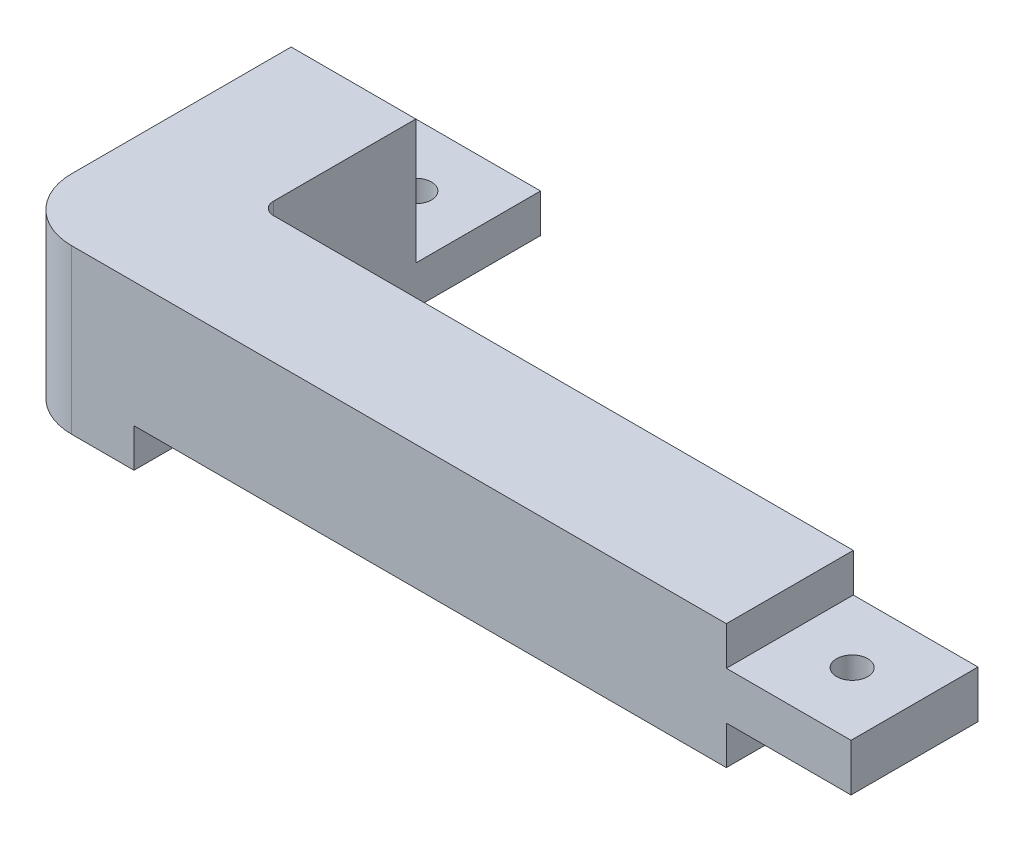
ISO-10303-21;
HEADER;
FILE_DESCRIPTION(('STEP AP214'),'2;1');
FILE_NAME('part.step','',(''),(''),'','','');
FILE_SCHEMA(('AUTOMOTIVE_DESIGN { 1 0 10303 214 1 1 1 1 }'));
ENDSEC;
DATA;
#1=APPLICATION_CONTEXT('core data for automotive mechanical design processes');
#2=APPLICATION_PROTOCOL_DEFINITION('international standard','automotive_design',2000,#1);
#3=PRODUCT_CONTEXT('',#1,'mechanical');
#4=PRODUCT('Part','Part','',(#3));
#5=PRODUCT_RELATED_PRODUCT_CATEGORY('part','',(#4));
#6=PRODUCT_DEFINITION_FORMATION('','',#4);
#7=PRODUCT_DEFINITION_CONTEXT('part definition',#1,'design');
#8=PRODUCT_DEFINITION('design','',#6,#7);
#9=PRODUCT_DEFINITION_SHAPE('','',#8);
#10=(LENGTH_UNIT() NAMED_UNIT(*) SI_UNIT(.MILLI.,.METRE.));
#11=(NAMED_UNIT(*) PLANE_ANGLE_UNIT() SI_UNIT($,.RADIAN.));
#12=(NAMED_UNIT(*) SI_UNIT($,.STERADIAN.) SOLID_ANGLE_UNIT());
#13=UNCERTAINTY_MEASURE_WITH_UNIT(LENGTH_MEASURE(1.E-05),#10,'distance_accuracy_value','');
#14=(GEOMETRIC_REPRESENTATION_CONTEXT(3) GLOBAL_UNCERTAINTY_ASSIGNED_CONTEXT((#13)) GLOBAL_UNIT_ASSIGNED_CONTEXT((#10,
#11,#12)) REPRESENTATION_CONTEXT('',''));
#15=CARTESIAN_POINT('',(0.,0.,0.));
#16=DIRECTION('',(0.,0.,1.));
#17=DIRECTION('',(1.,0.,0.));
#18=AXIS2_PLACEMENT_3D('',#15,#16,#17);
#19=CARTESIAN_POINT('',(147.000196891192,0.,0.));
#20=DIRECTION('',(-1.,0.,0.));
#21=DIRECTION('',(0.,0.,1.));
#22=AXIS2_PLACEMENT_3D('',#19,#20,#21);
#23=PLANE('',#22);
#24=DIRECTION('',(0.,0.,1.));
#25=VECTOR('',#24,1.);
#26=CARTESIAN_POINT('',(147.000196891192,25.4,56.9443652849741));
#27=LINE('',#26,#25);
#28=CARTESIAN_POINT('',(147.000196891192,25.4,31.0847305699482));
#29=VERTEX_POINT('',#28);
#30=CARTESIAN_POINT('',(147.000196891192,25.4,56.9443652849741));
#31=VERTEX_POINT('',#30);
#32=EDGE_CURVE('E173',#29,#31,#27,.T.);
#33=ORIENTED_EDGE('',*,*,#32,.F.);
#34=DIRECTION('',(0.,1.,0.));
#35=VECTOR('',#34,1.);
#36=CARTESIAN_POINT('',(147.000196891192,33.274,31.0847305699482));
#37=LINE('',#36,#35);
#38=CARTESIAN_POINT('',(147.000196891192,33.274,31.0847305699482));
#39=VERTEX_POINT('',#38);
#40=EDGE_CURVE('E216',#29,#39,#37,.T.);
#41=ORIENTED_EDGE('',*,*,#40,.T.);
#42=DIRECTION('',(0.,0.,1.));
#43=VECTOR('',#42,1.);
#44=CARTESIAN_POINT('',(147.000196891192,33.274,31.0847305699482));
#45=LINE('',#44,#43);
#46=CARTESIAN_POINT('',(147.000196891192,33.274,56.9443652849741));
#47=VERTEX_POINT('',#46);
#48=EDGE_CURVE('E215',#39,#47,#45,.T.);
#49=ORIENTED_EDGE('',*,*,#48,.T.);
#50=DIRECTION('',(0.,-1.,0.));
#51=VECTOR('',#50,1.);
#52=CARTESIAN_POINT('',(147.000196891192,33.274,56.9443652849741));
#53=LINE('',#52,#51);
#54=EDGE_CURVE('E220',#47,#31,#53,.T.);
#55=ORIENTED_EDGE('',*,*,#54,.T.);
#56=EDGE_LOOP('',(#33,#41,#49,#55));
#57=FACE_BOUND('',#56,.T.);
#58=ADVANCED_FACE('F45',(#57),#23,.F.);
#59=DIRECTION('',(0.,0.,-1.));
#60=VECTOR('',#59,1.);
#61=CARTESIAN_POINT('',(147.000196891192,15.748,56.9443652849741));
#62=LINE('',#61,#60);
#63=CARTESIAN_POINT('',(147.000196891192,15.748,56.9443652849741));
#64=VERTEX_POINT('',#63);
#65=CARTESIAN_POINT('',(147.000196891192,15.748,31.0847305699482));
#66=VERTEX_POINT('',#65);
#67=EDGE_CURVE('E341',#64,#66,#62,.T.);
#68=ORIENTED_EDGE('',*,*,#67,.F.);
#69=CARTESIAN_POINT('',(147.000196891192,7.874,56.9443652849741));
#70=VERTEX_POINT('',#69);
#71=EDGE_CURVE('E179',#64,#70,#53,.T.);
#72=ORIENTED_EDGE('',*,*,#71,.T.);
#73=DIRECTION('',(0.,0.,-1.));
#74=VECTOR('',#73,1.);
#75=CARTESIAN_POINT('',(147.000196891192,7.874,31.0847305699482));
#76=LINE('',#75,#74);
#77=CARTESIAN_POINT('',(147.000196891192,7.874,31.0847305699482));
#78=VERTEX_POINT('',#77);
#79=EDGE_CURVE('E223',#70,#78,#76,.T.);
#80=ORIENTED_EDGE('',*,*,#79,.T.);
#81=EDGE_CURVE('E212',#78,#66,#37,.T.);
#82=ORIENTED_EDGE('',*,*,#81,.T.);
#83=EDGE_LOOP('',(#68,#72,#80,#82));
#84=FACE_BOUND('',#83,.T.);
#85=ADVANCED_FACE('F340',(#84),#23,.F.);
#86=CARTESIAN_POINT('',(0.,33.274,0.));
#87=DIRECTION('',(0.,1.,0.));
#88=DIRECTION('',(0.,0.,1.));
#89=AXIS2_PLACEMENT_3D('',#86,#87,#88);
#90=PLANE('',#89);
#91=DIRECTION('',(0.,0.,1.));
#92=VECTOR('',#91,1.);
#93=CARTESIAN_POINT('',(0.950196891191725,33.274,56.9443652849741));
#94=LINE('',#93,#92);
#95=CARTESIAN_POINT('',(0.950196891191725,33.274,-0.459634715025914));
#96=VERTEX_POINT('',#95);
#97=CARTESIAN_POINT('',(0.950196891191725,33.274,44.2443652849741));
#98=VERTEX_POINT('',#97);
#99=EDGE_CURVE('E242',#96,#98,#94,.T.);
#100=ORIENTED_EDGE('',*,*,#99,.T.);
#101=CARTESIAN_POINT('',(13.6501968911917,33.274,44.2443652849741));
#102=DIRECTION('',(0.,1.,0.));
#103=DIRECTION('',(0.,0.,1.));
#104=AXIS2_PLACEMENT_3D('',#101,#102,#103);
#105=CIRCLE('',#104,12.7);
#106=CARTESIAN_POINT('',(13.6501968911917,33.274,56.9443652849741));
#107=VERTEX_POINT('',#106);
#108=EDGE_CURVE('E283',#98,#107,#105,.T.);
#109=ORIENTED_EDGE('',*,*,#108,.T.);
#110=DIRECTION('',(1.,0.,0.));
#111=VECTOR('',#110,1.);
#112=CARTESIAN_POINT('',(26.3501968911917,33.274,56.9443652849741));
#113=LINE('',#112,#111);
#114=EDGE_CURVE('E247',#107,#47,#113,.T.);
#115=ORIENTED_EDGE('',*,*,#114,.T.);
#116=ORIENTED_EDGE('',*,*,#48,.F.);
#117=DIRECTION('',(-1.,0.,0.));
#118=VECTOR('',#117,1.);
#119=CARTESIAN_POINT('',(147.000196891192,33.274,31.0847305699482));
#120=LINE('',#119,#118);
#121=CARTESIAN_POINT('',(28.8901968911918,33.274,31.0847305699482));
#122=VERTEX_POINT('',#121);
#123=EDGE_CURVE('E235',#39,#122,#120,.T.);
#124=ORIENTED_EDGE('',*,*,#123,.T.);
#125=CARTESIAN_POINT('',(28.8901968911917,33.274,28.5447305699482));
#126=DIRECTION('',(0.,1.,0.));
#127=DIRECTION('',(0.,0.,1.));
#128=AXIS2_PLACEMENT_3D('',#125,#126,#127);
#129=CIRCLE('',#128,2.54);
#130=CARTESIAN_POINT('',(26.3501968911917,33.274,28.5447305699482));
#131=VERTEX_POINT('',#130);
#132=EDGE_CURVE('E54',#122,#131,#129,.F.);
#133=ORIENTED_EDGE('',*,*,#132,.T.);
#134=DIRECTION('',(0.,0.,-1.));
#135=VECTOR('',#134,1.);
#136=CARTESIAN_POINT('',(26.3501968911917,33.274,56.9443652849741));
#137=LINE('',#136,#135);
#138=CARTESIAN_POINT('',(26.3501968911917,33.274,-0.459634715025914));
#139=VERTEX_POINT('',#138);
#140=EDGE_CURVE('E239',#131,#139,#137,.T.);
#141=ORIENTED_EDGE('',*,*,#140,.T.);
#142=DIRECTION('',(1.,0.,0.));
#143=VECTOR('',#142,1.);
#144=CARTESIAN_POINT('',(26.3501968911917,33.274,-0.459634715025914));
#145=LINE('',#144,#143);
#146=EDGE_CURVE('E201',#96,#139,#145,.T.);
#147=ORIENTED_EDGE('',*,*,#146,.F.);
#148=EDGE_LOOP('',(#100,#109,#115,#116,#124,#133,#141,#147));
#149=FACE_BOUND('',#148,.T.);
#150=ADVANCED_FACE('F304',(#149),#90,.T.);
#151=CARTESIAN_POINT('',(26.3501968911917,33.274,56.9443652849741));
#152=DIRECTION('',(-1.,0.,0.));
#153=DIRECTION('',(0.,0.,1.));
#154=AXIS2_PLACEMENT_3D('',#151,#152,#153);
#155=PLANE('',#154);
#156=ORIENTED_EDGE('',*,*,#140,.F.);
#157=DIRECTION('',(0.,1.,0.));
#158=VECTOR('',#157,1.);
#159=CARTESIAN_POINT('',(26.3501968911917,7.874,28.5447305699482));
#160=LINE('',#159,#158);
#161=CARTESIAN_POINT('',(26.3501968911917,7.874,28.5447305699482));
#162=VERTEX_POINT('',#161);
#163=EDGE_CURVE('E290',#131,#162,#160,.F.);
#164=ORIENTED_EDGE('',*,*,#163,.T.);
#165=DIRECTION('',(0.,0.,-1.));
#166=VECTOR('',#165,1.);
#167=CARTESIAN_POINT('',(26.3501968911917,7.874,31.0847305699482));
#168=LINE('',#167,#166);
#169=CARTESIAN_POINT('',(26.3501968911917,7.874,56.9443652849741));
#170=VERTEX_POINT('',#169);
#171=EDGE_CURVE('E60',#170,#162,#168,.T.);
#172=ORIENTED_EDGE('',*,*,#171,.F.);
#173=DIRECTION('',(0.,-1.,0.));
#174=VECTOR('',#173,1.);
#175=CARTESIAN_POINT('',(26.3501968911917,33.274,56.9443652849741));
#176=LINE('',#175,#174);
#177=CARTESIAN_POINT('',(26.3501968911917,0.,56.9443652849741));
#178=VERTEX_POINT('',#177);
#179=EDGE_CURVE('E250',#170,#178,#176,.T.);
#180=ORIENTED_EDGE('',*,*,#179,.T.);
#181=DIRECTION('',(0.,0.,-1.));
#182=VECTOR('',#181,1.);
#183=CARTESIAN_POINT('',(26.3501968911917,0.,56.9443652849741));
#184=LINE('',#183,#182);
#185=CARTESIAN_POINT('',(26.3501968911917,0.,-25.8596347150259));
#186=VERTEX_POINT('',#185);
#187=EDGE_CURVE('E238',#178,#186,#184,.T.);
#188=ORIENTED_EDGE('',*,*,#187,.T.);
#189=DIRECTION('',(0.,-1.,0.));
#190=VECTOR('',#189,1.);
#191=CARTESIAN_POINT('',(26.3501968911917,33.274,-25.8596347150259));
#192=LINE('',#191,#190);
#193=CARTESIAN_POINT('',(26.3501968911917,7.874,-25.8596347150259));
#194=VERTEX_POINT('',#193);
#195=EDGE_CURVE('E270',#194,#186,#192,.T.);
#196=ORIENTED_EDGE('',*,*,#195,.F.);
#197=DIRECTION('',(0.,0.,-1.));
#198=VECTOR('',#197,1.);
#199=CARTESIAN_POINT('',(26.3501968911917,7.874,-0.459634715025914));
#200=LINE('',#199,#198);
#201=CARTESIAN_POINT('',(26.3501968911917,7.874,-0.459634715025914));
#202=VERTEX_POINT('',#201);
#203=EDGE_CURVE('E204',#202,#194,#200,.T.);
#204=ORIENTED_EDGE('',*,*,#203,.F.);
#205=DIRECTION('',(0.,-1.,0.));
#206=VECTOR('',#205,1.);
#207=CARTESIAN_POINT('',(26.3501968911917,33.274,-0.459634715025914));
#208=LINE('',#207,#206);
#209=EDGE_CURVE('E185',#139,#202,#208,.T.);
#210=ORIENTED_EDGE('',*,*,#209,.F.);
#211=EDGE_LOOP('',(#156,#164,#172,#180,#188,#196,#204,#210));
#212=FACE_BOUND('',#211,.T.);
#213=ADVANCED_FACE('F313',(#212),#155,.F.);
#214=CARTESIAN_POINT('',(26.3501968911917,33.274,-25.8596347150259));
#215=DIRECTION('',(0.,0.,1.));
#216=DIRECTION('',(1.,0.,0.));
#217=AXIS2_PLACEMENT_3D('',#214,#215,#216);
#218=PLANE('',#217);
#219=DIRECTION('',(0.,-1.,0.));
#220=VECTOR('',#219,1.);
#221=CARTESIAN_POINT('',(0.950196891191725,33.274,-25.8596347150259));
#222=LINE('',#221,#220);
#223=CARTESIAN_POINT('',(0.950196891191725,7.874,-25.8596347150259));
#224=VERTEX_POINT('',#223);
#225=CARTESIAN_POINT('',(0.950196891191725,0.,-25.8596347150259));
#226=VERTEX_POINT('',#225);
#227=EDGE_CURVE('E267',#224,#226,#222,.T.);
#228=ORIENTED_EDGE('',*,*,#227,.F.);
#229=DIRECTION('',(-1.,0.,0.));
#230=VECTOR('',#229,1.);
#231=CARTESIAN_POINT('',(26.3501968911917,7.874,-25.8596347150259));
#232=LINE('',#231,#230);
#233=EDGE_CURVE('E181',#194,#224,#232,.T.);
#234=ORIENTED_EDGE('',*,*,#233,.F.);
#235=ORIENTED_EDGE('',*,*,#195,.T.);
#236=DIRECTION('',(-1.,0.,0.));
#237=VECTOR('',#236,1.);
#238=CARTESIAN_POINT('',(26.3501968911917,0.,-25.8596347150259));
#239=LINE('',#238,#237);
#240=EDGE_CURVE('E254',#186,#226,#239,.T.);
#241=ORIENTED_EDGE('',*,*,#240,.T.);
#242=EDGE_LOOP('',(#228,#234,#235,#241));
#243=FACE_BOUND('',#242,.T.);
#244=ADVANCED_FACE('F383',(#243),#218,.F.);
#245=CARTESIAN_POINT('',(0.950196891191725,33.274,56.9443652849741));
#246=DIRECTION('',(1.,0.,0.));
#247=DIRECTION('',(0.,0.,-1.));
#248=AXIS2_PLACEMENT_3D('',#245,#246,#247);
#249=PLANE('',#248);
#250=DIRECTION('',(0.,0.,1.));
#251=VECTOR('',#250,1.);
#252=CARTESIAN_POINT('',(0.950196891191725,0.,56.9443652849741));
#253=LINE('',#252,#251);
#254=CARTESIAN_POINT('',(0.950196891191725,0.,44.2443652849741));
#255=VERTEX_POINT('',#254);
#256=EDGE_CURVE('E258',#226,#255,#253,.T.);
#257=ORIENTED_EDGE('',*,*,#256,.T.);
#258=DIRECTION('',(0.,-1.,0.));
#259=VECTOR('',#258,1.);
#260=CARTESIAN_POINT('',(0.950196891191725,33.274,44.2443652849741));
#261=LINE('',#260,#259);
#262=EDGE_CURVE('E280',#255,#98,#261,.F.);
#263=ORIENTED_EDGE('',*,*,#262,.T.);
#264=ORIENTED_EDGE('',*,*,#99,.F.);
#265=DIRECTION('',(0.,1.,0.));
#266=VECTOR('',#265,1.);
#267=CARTESIAN_POINT('',(0.950196891191732,33.274,-0.459634715025907));
#268=LINE('',#267,#266);
#269=CARTESIAN_POINT('',(0.950196891191732,7.874,-0.459634715025907));
#270=VERTEX_POINT('',#269);
#271=EDGE_CURVE('E198',#270,#96,#268,.T.);
#272=ORIENTED_EDGE('',*,*,#271,.F.);
#273=DIRECTION('',(0.,0.,-1.));
#274=VECTOR('',#273,1.);
#275=CARTESIAN_POINT('',(0.950196891191732,7.874,-0.459634715025907));
#276=LINE('',#275,#274);
#277=EDGE_CURVE('E206',#270,#224,#276,.T.);
#278=ORIENTED_EDGE('',*,*,#277,.T.);
#279=ORIENTED_EDGE('',*,*,#227,.T.);
#280=EDGE_LOOP('',(#257,#263,#264,#272,#278,#279));
#281=FACE_BOUND('',#280,.T.);
#282=ADVANCED_FACE('F323',(#281),#249,.F.);
#283=CARTESIAN_POINT('',(26.3501968911917,33.274,56.9443652849741));
#284=DIRECTION('',(0.,0.,-1.));
#285=DIRECTION('',(-1.,0.,0.));
#286=AXIS2_PLACEMENT_3D('',#283,#284,#285);
#287=PLANE('',#286);
#288=ORIENTED_EDGE('',*,*,#114,.F.);
#289=DIRECTION('',(0.,-1.,0.));
#290=VECTOR('',#289,1.);
#291=CARTESIAN_POINT('',(13.6501968911917,33.274,56.9443652849741));
#292=LINE('',#291,#290);
#293=CARTESIAN_POINT('',(13.6501968911917,0.,56.9443652849741));
#294=VERTEX_POINT('',#293);
#295=EDGE_CURVE('E273',#107,#294,#292,.T.);
#296=ORIENTED_EDGE('',*,*,#295,.T.);
#297=DIRECTION('',(1.,0.,0.));
#298=VECTOR('',#297,1.);
#299=CARTESIAN_POINT('',(26.3501968911917,0.,56.9443652849741));
#300=LINE('',#299,#298);
#301=EDGE_CURVE('E243',#294,#178,#300,.T.);
#302=ORIENTED_EDGE('',*,*,#301,.T.);
#303=ORIENTED_EDGE('',*,*,#179,.F.);
#304=DIRECTION('',(-1.,0.,0.));
#305=VECTOR('',#304,1.);
#306=CARTESIAN_POINT('',(147.000196891192,7.874,56.9443652849741));
#307=LINE('',#306,#305);
#308=EDGE_CURVE('E232',#70,#170,#307,.T.);
#309=ORIENTED_EDGE('',*,*,#308,.F.);
#310=ORIENTED_EDGE('',*,*,#71,.F.);
#311=DIRECTION('',(-1.,0.,0.));
#312=VECTOR('',#311,1.);
#313=CARTESIAN_POINT('',(172.400196891192,15.748,56.9443652849741));
#314=LINE('',#313,#312);
#315=CARTESIAN_POINT('',(172.400196891192,15.748,56.9443652849741));
#316=VERTEX_POINT('',#315);
#317=EDGE_CURVE('E156',#316,#64,#314,.T.);
#318=ORIENTED_EDGE('',*,*,#317,.F.);
#319=DIRECTION('',(0.,-1.,0.));
#320=VECTOR('',#319,1.);
#321=CARTESIAN_POINT('',(172.400196891192,25.4,56.9443652849741));
#322=LINE('',#321,#320);
#323=CARTESIAN_POINT('',(172.400196891192,25.4,56.9443652849741));
#324=VERTEX_POINT('',#323);
#325=EDGE_CURVE('E163',#324,#316,#322,.T.);
#326=ORIENTED_EDGE('',*,*,#325,.F.);
#327=DIRECTION('',(-1.,0.,0.));
#328=VECTOR('',#327,1.);
#329=CARTESIAN_POINT('',(172.400196891192,25.4,56.9443652849741));
#330=LINE('',#329,#328);
#331=EDGE_CURVE('E354',#324,#31,#330,.T.);
#332=ORIENTED_EDGE('',*,*,#331,.T.);
#333=ORIENTED_EDGE('',*,*,#54,.F.);
#334=EDGE_LOOP('',(#288,#296,#302,#303,#309,#310,#318,#326,#332,#333));
#335=FACE_BOUND('',#334,.T.);
#336=ADVANCED_FACE('F177',(#335),#287,.F.);
#337=CARTESIAN_POINT('',(0.,0.,0.));
#338=DIRECTION('',(0.,1.,0.));
#339=DIRECTION('',(0.,0.,1.));
#340=AXIS2_PLACEMENT_3D('',#337,#338,#339);
#341=PLANE('',#340);
#342=CARTESIAN_POINT('',(13.6501968911917,0.,-13.1596347150259));
#343=DIRECTION('',(0.,1.,0.));
#344=DIRECTION('',(0.,0.,1.));
#345=AXIS2_PLACEMENT_3D('',#342,#343,#344);
#346=CIRCLE('',#345,3.175);
#347=CARTESIAN_POINT('',(13.6501968911917,0.,-9.98463471502591));
#348=VERTEX_POINT('',#347);
#349=EDGE_CURVE('E365',#348,#348,#346,.T.);
#350=ORIENTED_EDGE('',*,*,#349,.T.);
#351=EDGE_LOOP('',(#350));
#352=FACE_BOUND('',#351,.T.);
#353=ORIENTED_EDGE('',*,*,#301,.F.);
#354=CARTESIAN_POINT('',(13.6501968911917,0.,44.2443652849741));
#355=DIRECTION('',(0.,1.,0.));
#356=DIRECTION('',(0.,0.,1.));
#357=AXIS2_PLACEMENT_3D('',#354,#355,#356);
#358=CIRCLE('',#357,12.7);
#359=EDGE_CURVE('E277',#294,#255,#358,.F.);
#360=ORIENTED_EDGE('',*,*,#359,.T.);
#361=ORIENTED_EDGE('',*,*,#256,.F.);
#362=ORIENTED_EDGE('',*,*,#240,.F.);
#363=ORIENTED_EDGE('',*,*,#187,.F.);
#364=EDGE_LOOP('',(#353,#360,#361,#362,#363));
#365=FACE_BOUND('',#364,.T.);
#366=ADVANCED_FACE('F333',(#352,#365),#341,.F.);
#367=CARTESIAN_POINT('',(147.000196891192,33.274,31.0847305699482));
#368=DIRECTION('',(0.,0.,1.));
#369=DIRECTION('',(1.,0.,0.));
#370=AXIS2_PLACEMENT_3D('',#367,#368,#369);
#371=PLANE('',#370);
#372=DIRECTION('',(-1.,0.,0.));
#373=VECTOR('',#372,1.);
#374=CARTESIAN_POINT('',(147.000196891192,7.874,31.0847305699482));
#375=LINE('',#374,#373);
#376=CARTESIAN_POINT('',(28.8901968911918,7.874,31.0847305699482));
#377=VERTEX_POINT('',#376);
#378=EDGE_CURVE('E226',#78,#377,#375,.T.);
#379=ORIENTED_EDGE('',*,*,#378,.T.);
#380=DIRECTION('',(0.,1.,0.));
#381=VECTOR('',#380,1.);
#382=CARTESIAN_POINT('',(28.8901968911917,33.274,31.0847305699482));
#383=LINE('',#382,#381);
#384=EDGE_CURVE('E286',#377,#122,#383,.T.);
#385=ORIENTED_EDGE('',*,*,#384,.T.);
#386=ORIENTED_EDGE('',*,*,#123,.F.);
#387=ORIENTED_EDGE('',*,*,#40,.F.);
#388=DIRECTION('',(-1.,0.,0.));
#389=VECTOR('',#388,1.);
#390=CARTESIAN_POINT('',(172.400196891192,25.4,31.0847305699482));
#391=LINE('',#390,#389);
#392=CARTESIAN_POINT('',(172.400196891192,25.4,31.0847305699482));
#393=VERTEX_POINT('',#392);
#394=EDGE_CURVE('E187',#393,#29,#391,.T.);
#395=ORIENTED_EDGE('',*,*,#394,.F.);
#396=DIRECTION('',(0.,1.,0.));
#397=VECTOR('',#396,1.);
#398=CARTESIAN_POINT('',(172.400196891192,25.4,31.0847305699482));
#399=LINE('',#398,#397);
#400=CARTESIAN_POINT('',(172.400196891192,15.748,31.0847305699482));
#401=VERTEX_POINT('',#400);
#402=EDGE_CURVE('E162',#401,#393,#399,.T.);
#403=ORIENTED_EDGE('',*,*,#402,.F.);
#404=DIRECTION('',(-1.,0.,0.));
#405=VECTOR('',#404,1.);
#406=CARTESIAN_POINT('',(172.400196891192,15.748,31.0847305699482));
#407=LINE('',#406,#405);
#408=EDGE_CURVE('E158',#401,#66,#407,.T.);
#409=ORIENTED_EDGE('',*,*,#408,.T.);
#410=ORIENTED_EDGE('',*,*,#81,.F.);
#411=EDGE_LOOP('',(#379,#385,#386,#387,#395,#403,#409,#410));
#412=FACE_BOUND('',#411,.T.);
#413=ADVANCED_FACE('F305',(#412),#371,.F.);
#414=CARTESIAN_POINT('',(147.000196891192,7.874,31.0847305699482));
#415=DIRECTION('',(0.,1.,0.));
#416=DIRECTION('',(0.,0.,1.));
#417=AXIS2_PLACEMENT_3D('',#414,#415,#416);
#418=PLANE('',#417);
#419=ORIENTED_EDGE('',*,*,#171,.T.);
#420=CARTESIAN_POINT('',(28.8901968911917,7.874,28.5447305699482));
#421=DIRECTION('',(0.,1.,0.));
#422=DIRECTION('',(0.,0.,1.));
#423=AXIS2_PLACEMENT_3D('',#420,#421,#422);
#424=CIRCLE('',#423,2.54);
#425=EDGE_CURVE('E11',#162,#377,#424,.T.);
#426=ORIENTED_EDGE('',*,*,#425,.T.);
#427=ORIENTED_EDGE('',*,*,#378,.F.);
#428=ORIENTED_EDGE('',*,*,#79,.F.);
#429=ORIENTED_EDGE('',*,*,#308,.T.);
#430=EDGE_LOOP('',(#419,#426,#427,#428,#429));
#431=FACE_BOUND('',#430,.T.);
#432=ADVANCED_FACE('F338',(#431),#418,.F.);
#433=CARTESIAN_POINT('',(26.3501968911917,7.874,-0.459634715025914));
#434=DIRECTION('',(0.,-1.,0.));
#435=DIRECTION('',(0.,0.,-1.));
#436=AXIS2_PLACEMENT_3D('',#433,#434,#435);
#437=PLANE('',#436);
#438=CARTESIAN_POINT('',(13.6501968911917,7.874,-13.1596347150259));
#439=DIRECTION('',(0.,1.,0.));
#440=DIRECTION('',(0.,0.,1.));
#441=AXIS2_PLACEMENT_3D('',#438,#439,#440);
#442=CIRCLE('',#441,3.175);
#443=CARTESIAN_POINT('',(13.6501968911917,7.874,-9.98463471502591));
#444=VERTEX_POINT('',#443);
#445=EDGE_CURVE('E369',#444,#444,#442,.T.);
#446=ORIENTED_EDGE('',*,*,#445,.F.);
#447=EDGE_LOOP('',(#446));
#448=FACE_BOUND('',#447,.T.);
#449=ORIENTED_EDGE('',*,*,#233,.T.);
#450=ORIENTED_EDGE('',*,*,#277,.F.);
#451=DIRECTION('',(-1.,0.,0.));
#452=VECTOR('',#451,1.);
#453=CARTESIAN_POINT('',(26.3501968911917,7.874,-0.459634715025914));
#454=LINE('',#453,#452);
#455=EDGE_CURVE('E194',#202,#270,#454,.T.);
#456=ORIENTED_EDGE('',*,*,#455,.F.);
#457=ORIENTED_EDGE('',*,*,#203,.T.);
#458=EDGE_LOOP('',(#449,#450,#456,#457));
#459=FACE_BOUND('',#458,.T.);
#460=ADVANCED_FACE('F377',(#448,#459),#437,.F.);
#461=CARTESIAN_POINT('',(0.,0.,-0.459634715025907));
#462=DIRECTION('',(0.,0.,-1.));
#463=DIRECTION('',(-1.,0.,0.));
#464=AXIS2_PLACEMENT_3D('',#461,#462,#463);
#465=PLANE('',#464);
#466=ORIENTED_EDGE('',*,*,#209,.T.);
#467=ORIENTED_EDGE('',*,*,#455,.T.);
#468=ORIENTED_EDGE('',*,*,#271,.T.);
#469=ORIENTED_EDGE('',*,*,#146,.T.);
#470=EDGE_LOOP('',(#466,#467,#468,#469));
#471=FACE_BOUND('',#470,.T.);
#472=ADVANCED_FACE('F320',(#471),#465,.T.);
#473=CARTESIAN_POINT('',(172.400196891192,15.748,56.9443652849741));
#474=DIRECTION('',(0.,1.,0.));
#475=DIRECTION('',(0.,0.,1.));
#476=AXIS2_PLACEMENT_3D('',#473,#474,#475);
#477=PLANE('',#476);
#478=CARTESIAN_POINT('',(159.700196891192,15.748,44.0145479274611));
#479=DIRECTION('',(0.,1.,0.));
#480=DIRECTION('',(0.,0.,1.));
#481=AXIS2_PLACEMENT_3D('',#478,#479,#480);
#482=CIRCLE('',#481,3.175);
#483=CARTESIAN_POINT('',(159.700196891192,15.748,47.1895479274611));
#484=VERTEX_POINT('',#483);
#485=EDGE_CURVE('E343',#484,#484,#482,.T.);
#486=ORIENTED_EDGE('',*,*,#485,.T.);
#487=EDGE_LOOP('',(#486));
#488=FACE_BOUND('',#487,.T.);
#489=ORIENTED_EDGE('',*,*,#67,.T.);
#490=ORIENTED_EDGE('',*,*,#408,.F.);
#491=DIRECTION('',(0.,0.,-1.));
#492=VECTOR('',#491,1.);
#493=CARTESIAN_POINT('',(172.400196891192,15.748,56.9443652849741));
#494=LINE('',#493,#492);
#495=EDGE_CURVE('E151',#316,#401,#494,.T.);
#496=ORIENTED_EDGE('',*,*,#495,.F.);
#497=ORIENTED_EDGE('',*,*,#317,.T.);
#498=EDGE_LOOP('',(#489,#490,#496,#497));
#499=FACE_BOUND('',#498,.T.);
#500=ADVANCED_FACE('F154',(#488,#499),#477,.F.);
#501=CARTESIAN_POINT('',(172.400196891192,25.4,56.9443652849741));
#502=DIRECTION('',(0.,-1.,0.));
#503=DIRECTION('',(0.,0.,-1.));
#504=AXIS2_PLACEMENT_3D('',#501,#502,#503);
#505=PLANE('',#504);
#506=CARTESIAN_POINT('',(159.700196891192,25.4,44.0145479274611));
#507=DIRECTION('',(0.,1.,0.));
#508=DIRECTION('',(0.,0.,1.));
#509=AXIS2_PLACEMENT_3D('',#506,#507,#508);
#510=CIRCLE('',#509,3.175);
#511=CARTESIAN_POINT('',(159.700196891192,25.4,47.1895479274611));
#512=VERTEX_POINT('',#511);
#513=EDGE_CURVE('E349',#512,#512,#510,.T.);
#514=ORIENTED_EDGE('',*,*,#513,.F.);
#515=EDGE_LOOP('',(#514));
#516=FACE_BOUND('',#515,.T.);
#517=ORIENTED_EDGE('',*,*,#32,.T.);
#518=ORIENTED_EDGE('',*,*,#331,.F.);
#519=DIRECTION('',(0.,0.,1.));
#520=VECTOR('',#519,1.);
#521=CARTESIAN_POINT('',(172.400196891192,25.4,56.9443652849741));
#522=LINE('',#521,#520);
#523=EDGE_CURVE('E168',#393,#324,#522,.T.);
#524=ORIENTED_EDGE('',*,*,#523,.F.);
#525=ORIENTED_EDGE('',*,*,#394,.T.);
#526=EDGE_LOOP('',(#517,#518,#524,#525));
#527=FACE_BOUND('',#526,.T.);
#528=ADVANCED_FACE('F358',(#516,#527),#505,.F.);
#529=CARTESIAN_POINT('',(172.400196891192,0.,0.));
#530=DIRECTION('',(1.,0.,0.));
#531=DIRECTION('',(0.,0.,-1.));
#532=AXIS2_PLACEMENT_3D('',#529,#530,#531);
#533=PLANE('',#532);
#534=ORIENTED_EDGE('',*,*,#325,.T.);
#535=ORIENTED_EDGE('',*,*,#495,.T.);
#536=ORIENTED_EDGE('',*,*,#402,.T.);
#537=ORIENTED_EDGE('',*,*,#523,.T.);
#538=EDGE_LOOP('',(#534,#535,#536,#537));
#539=FACE_BOUND('',#538,.T.);
#540=ADVANCED_FACE('F166',(#539),#533,.T.);
#541=CARTESIAN_POINT('',(159.700196891192,-16.002,44.0145479274611));
#542=DIRECTION('',(0.,1.,0.));
#543=DIRECTION('',(0.,0.,1.));
#544=AXIS2_PLACEMENT_3D('',#541,#542,#543);
#545=CYLINDRICAL_SURFACE('',#544,3.175);
#546=ORIENTED_EDGE('',*,*,#513,.T.);
#547=EDGE_LOOP('',(#546));
#548=FACE_BOUND('',#547,.T.);
#549=ORIENTED_EDGE('',*,*,#485,.F.);
#550=EDGE_LOOP('',(#549));
#551=FACE_BOUND('',#550,.T.);
#552=ADVANCED_FACE('F423',(#548,#551),#545,.F.);
#553=CARTESIAN_POINT('',(13.6501968911917,33.274,44.2443652849741));
#554=DIRECTION('',(0.,-1.,0.));
#555=DIRECTION('',(0.,0.,-1.));
#556=AXIS2_PLACEMENT_3D('',#553,#554,#555);
#557=CYLINDRICAL_SURFACE('',#556,12.7);
#558=ORIENTED_EDGE('',*,*,#108,.F.);
#559=ORIENTED_EDGE('',*,*,#262,.F.);
#560=ORIENTED_EDGE('',*,*,#359,.F.);
#561=ORIENTED_EDGE('',*,*,#295,.F.);
#562=EDGE_LOOP('',(#558,#559,#560,#561));
#563=FACE_BOUND('',#562,.T.);
#564=ADVANCED_FACE('F329',(#563),#557,.T.);
#565=CARTESIAN_POINT('',(28.8901968911917,33.274,28.5447305699482));
#566=DIRECTION('',(0.,-1.,0.));
#567=DIRECTION('',(0.,0.,-1.));
#568=AXIS2_PLACEMENT_3D('',#565,#566,#567);
#569=CYLINDRICAL_SURFACE('',#568,2.54);
#570=ORIENTED_EDGE('',*,*,#425,.F.);
#571=ORIENTED_EDGE('',*,*,#163,.F.);
#572=ORIENTED_EDGE('',*,*,#132,.F.);
#573=ORIENTED_EDGE('',*,*,#384,.F.);
#574=EDGE_LOOP('',(#570,#571,#572,#573));
#575=FACE_BOUND('',#574,.T.);
#576=ADVANCED_FACE('F47',(#575),#569,.F.);
#577=CARTESIAN_POINT('',(13.6501968911917,-17.526,-13.1596347150259));
#578=DIRECTION('',(0.,1.,0.));
#579=DIRECTION('',(0.,0.,1.));
#580=AXIS2_PLACEMENT_3D('',#577,#578,#579);
#581=CYLINDRICAL_SURFACE('',#580,3.175);
#582=ORIENTED_EDGE('',*,*,#445,.T.);
#583=EDGE_LOOP('',(#582));
#584=FACE_BOUND('',#583,.T.);
#585=ORIENTED_EDGE('',*,*,#349,.F.);
#586=EDGE_LOOP('',(#585));
#587=FACE_BOUND('',#586,.T.);
#588=ADVANCED_FACE('F374',(#584,#587),#581,.F.);
#589=CLOSED_SHELL('',(#58,#85,#150,#213,#244,#282,#336,#366,#413,#432,#460,#472,#500,#528,#540,
#552,#564,#576,#588));
#590=MANIFOLD_SOLID_BREP('B2',#589);
#591=ADVANCED_BREP_SHAPE_REPRESENTATION('',(#18,#590),#14);
#592=SHAPE_DEFINITION_REPRESENTATION(#9,#591);
ENDSEC;
END-ISO-10303-21;
